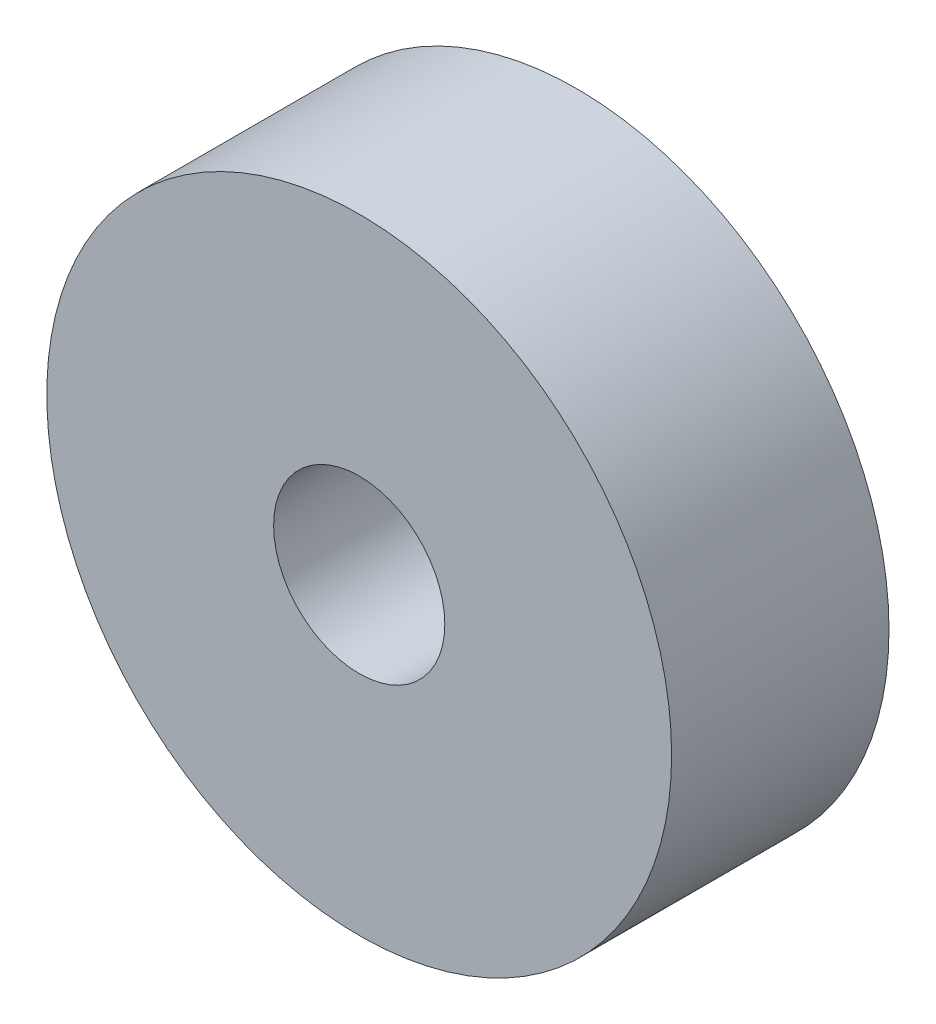
ISO-10303-21;
HEADER;
FILE_DESCRIPTION(('STEP AP214'),'2;1');
FILE_NAME('part.step','',(''),(''),'','','');
FILE_SCHEMA(('AUTOMOTIVE_DESIGN { 1 0 10303 214 1 1 1 1 }'));
ENDSEC;
DATA;
#1=APPLICATION_CONTEXT('core data for automotive mechanical design processes');
#2=APPLICATION_PROTOCOL_DEFINITION('international standard','automotive_design',2000,#1);
#3=PRODUCT_CONTEXT('',#1,'mechanical');
#4=PRODUCT('Part','Part','',(#3));
#5=PRODUCT_RELATED_PRODUCT_CATEGORY('part','',(#4));
#6=PRODUCT_DEFINITION_FORMATION('','',#4);
#7=PRODUCT_DEFINITION_CONTEXT('part definition',#1,'design');
#8=PRODUCT_DEFINITION('design','',#6,#7);
#9=PRODUCT_DEFINITION_SHAPE('','',#8);
#10=(LENGTH_UNIT() NAMED_UNIT(*) SI_UNIT(.MILLI.,.METRE.));
#11=(NAMED_UNIT(*) PLANE_ANGLE_UNIT() SI_UNIT($,.RADIAN.));
#12=(NAMED_UNIT(*) SI_UNIT($,.STERADIAN.) SOLID_ANGLE_UNIT());
#13=UNCERTAINTY_MEASURE_WITH_UNIT(LENGTH_MEASURE(1.E-05),#10,'distance_accuracy_value','');
#14=(GEOMETRIC_REPRESENTATION_CONTEXT(3) GLOBAL_UNCERTAINTY_ASSIGNED_CONTEXT((#13)) GLOBAL_UNIT_ASSIGNED_CONTEXT((#10,
#11,#12)) REPRESENTATION_CONTEXT('',''));
#15=CARTESIAN_POINT('',(0.,0.,0.));
#16=DIRECTION('',(0.,0.,1.));
#17=DIRECTION('',(1.,0.,0.));
#18=AXIS2_PLACEMENT_3D('',#15,#16,#17);
#19=CARTESIAN_POINT('',(0.,0.,2.54));
#20=DIRECTION('',(0.,0.,-1.));
#21=DIRECTION('',(-1.,0.,0.));
#22=AXIS2_PLACEMENT_3D('',#19,#20,#21);
#23=CYLINDRICAL_SURFACE('',#22,1.);
#24=CARTESIAN_POINT('',(0.,0.,2.54));
#25=DIRECTION('',(0.,0.,1.));
#26=DIRECTION('',(1.,0.,0.));
#27=AXIS2_PLACEMENT_3D('',#24,#25,#26);
#28=CIRCLE('',#27,1.);
#29=CARTESIAN_POINT('',(1.,0.,2.54));
#30=VERTEX_POINT('',#29);
#31=EDGE_CURVE('E48',#30,#30,#28,.T.);
#32=ORIENTED_EDGE('',*,*,#31,.T.);
#33=EDGE_LOOP('',(#32));
#34=FACE_BOUND('',#33,.T.);
#35=CARTESIAN_POINT('',(0.,0.,0.85));
#36=DIRECTION('',(0.,0.,-1.));
#37=DIRECTION('',(-1.,0.,0.));
#38=AXIS2_PLACEMENT_3D('',#35,#36,#37);
#39=CIRCLE('',#38,1.);
#40=CARTESIAN_POINT('',(-1.,0.,0.85));
#41=VERTEX_POINT('',#40);
#42=EDGE_CURVE('E39',#41,#41,#39,.T.);
#43=ORIENTED_EDGE('',*,*,#42,.T.);
#44=EDGE_LOOP('',(#43));
#45=FACE_BOUND('',#44,.T.);
#46=ADVANCED_FACE('F35',(#34,#45),#23,.F.);
#47=CARTESIAN_POINT('',(0.,0.,2.54));
#48=DIRECTION('',(0.,0.,1.));
#49=DIRECTION('',(1.,0.,0.));
#50=AXIS2_PLACEMENT_3D('',#47,#48,#49);
#51=PLANE('',#50);
#52=CARTESIAN_POINT('',(0.,0.,2.54));
#53=DIRECTION('',(0.,0.,1.));
#54=DIRECTION('',(1.,0.,0.));
#55=AXIS2_PLACEMENT_3D('',#52,#53,#54);
#56=CIRCLE('',#55,3.65);
#57=CARTESIAN_POINT('',(3.65,0.,2.54));
#58=VERTEX_POINT('',#57);
#59=EDGE_CURVE('E10',#58,#58,#56,.T.);
#60=ORIENTED_EDGE('',*,*,#59,.T.);
#61=EDGE_LOOP('',(#60));
#62=FACE_BOUND('',#61,.T.);
#63=ORIENTED_EDGE('',*,*,#31,.F.);
#64=EDGE_LOOP('',(#63));
#65=FACE_BOUND('',#64,.T.);
#66=ADVANCED_FACE('F73',(#62,#65),#51,.T.);
#67=CARTESIAN_POINT('',(0.,0.,0.));
#68=DIRECTION('',(0.,0.,1.));
#69=DIRECTION('',(1.,0.,0.));
#70=AXIS2_PLACEMENT_3D('',#67,#68,#69);
#71=PLANE('',#70);
#72=CARTESIAN_POINT('',(0.,0.,0.));
#73=DIRECTION('',(0.,0.,-1.));
#74=DIRECTION('',(-1.,0.,0.));
#75=AXIS2_PLACEMENT_3D('',#72,#73,#74);
#76=CIRCLE('',#75,1.45);
#77=CARTESIAN_POINT('',(-1.45,0.,0.));
#78=VERTEX_POINT('',#77);
#79=EDGE_CURVE('E52',#78,#78,#76,.T.);
#80=ORIENTED_EDGE('',*,*,#79,.F.);
#81=EDGE_LOOP('',(#80));
#82=FACE_BOUND('',#81,.T.);
#83=CARTESIAN_POINT('',(0.,0.,0.));
#84=DIRECTION('',(0.,0.,1.));
#85=DIRECTION('',(1.,0.,0.));
#86=AXIS2_PLACEMENT_3D('',#83,#84,#85);
#87=CIRCLE('',#86,3.65);
#88=CARTESIAN_POINT('',(3.65,0.,0.));
#89=VERTEX_POINT('',#88);
#90=EDGE_CURVE('E43',#89,#89,#87,.T.);
#91=ORIENTED_EDGE('',*,*,#90,.F.);
#92=EDGE_LOOP('',(#91));
#93=FACE_BOUND('',#92,.T.);
#94=ADVANCED_FACE('F79',(#82,#93),#71,.F.);
#95=CARTESIAN_POINT('',(0.,0.,2.54));
#96=DIRECTION('',(0.,0.,-1.));
#97=DIRECTION('',(-1.,0.,0.));
#98=AXIS2_PLACEMENT_3D('',#95,#96,#97);
#99=CYLINDRICAL_SURFACE('',#98,3.65);
#100=ORIENTED_EDGE('',*,*,#59,.F.);
#101=EDGE_LOOP('',(#100));
#102=FACE_BOUND('',#101,.T.);
#103=ORIENTED_EDGE('',*,*,#90,.T.);
#104=EDGE_LOOP('',(#103));
#105=FACE_BOUND('',#104,.T.);
#106=ADVANCED_FACE('F37',(#102,#105),#99,.T.);
#107=CARTESIAN_POINT('',(0.,0.,0.85));
#108=DIRECTION('',(0.,0.,-1.));
#109=DIRECTION('',(-1.,0.,0.));
#110=AXIS2_PLACEMENT_3D('',#107,#108,#109);
#111=CYLINDRICAL_SURFACE('',#110,1.45);
#112=CARTESIAN_POINT('',(0.,0.,0.85));
#113=DIRECTION('',(0.,0.,-1.));
#114=DIRECTION('',(-1.,0.,0.));
#115=AXIS2_PLACEMENT_3D('',#112,#113,#114);
#116=CIRCLE('',#115,1.45);
#117=CARTESIAN_POINT('',(-1.45,0.,0.85));
#118=VERTEX_POINT('',#117);
#119=EDGE_CURVE('E55',#118,#118,#116,.T.);
#120=ORIENTED_EDGE('',*,*,#119,.F.);
#121=EDGE_LOOP('',(#120));
#122=FACE_BOUND('',#121,.T.);
#123=ORIENTED_EDGE('',*,*,#79,.T.);
#124=EDGE_LOOP('',(#123));
#125=FACE_BOUND('',#124,.T.);
#126=ADVANCED_FACE('F65',(#122,#125),#111,.F.);
#127=CARTESIAN_POINT('',(0.,0.,0.85));
#128=DIRECTION('',(0.,0.,-1.));
#129=DIRECTION('',(-1.,0.,0.));
#130=AXIS2_PLACEMENT_3D('',#127,#128,#129);
#131=PLANE('',#130);
#132=ORIENTED_EDGE('',*,*,#42,.F.);
#133=EDGE_LOOP('',(#132));
#134=FACE_BOUND('',#133,.T.);
#135=ORIENTED_EDGE('',*,*,#119,.T.);
#136=EDGE_LOOP('',(#135));
#137=FACE_BOUND('',#136,.T.);
#138=ADVANCED_FACE('F63',(#134,#137),#131,.T.);
#139=CLOSED_SHELL('',(#46,#66,#94,#106,#126,#138));
#140=MANIFOLD_SOLID_BREP('B2',#139);
#141=ADVANCED_BREP_SHAPE_REPRESENTATION('',(#18,#140),#14);
#142=SHAPE_DEFINITION_REPRESENTATION(#9,#141);
ENDSEC;
END-ISO-10303-21;
